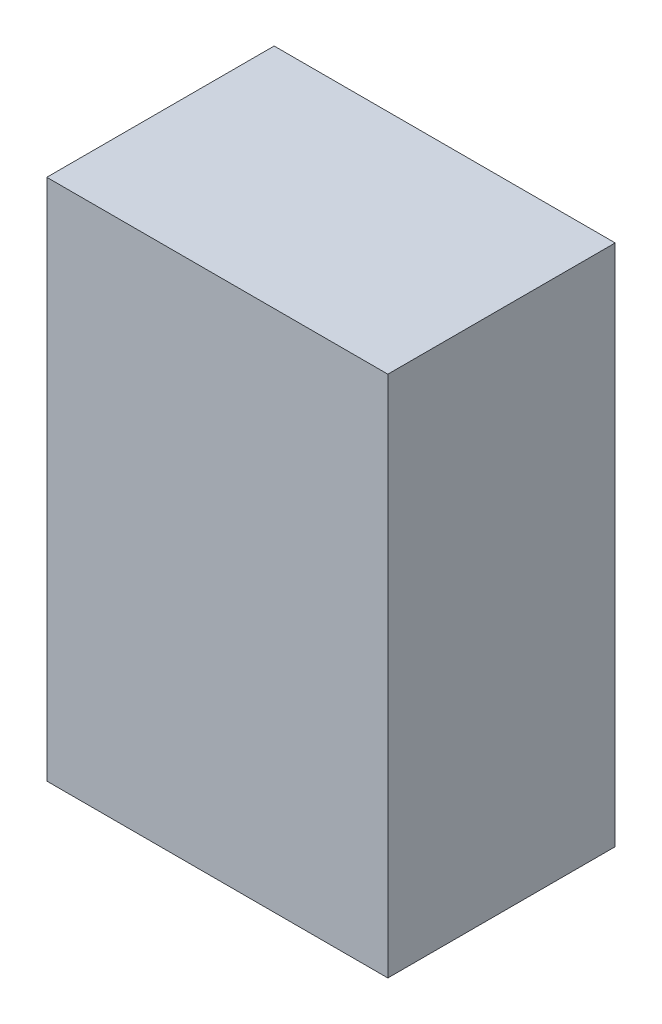
ISO-10303-21;
HEADER;
FILE_DESCRIPTION(('STEP AP214'),'2;1');
FILE_NAME('part.step','',(''),(''),'','','');
FILE_SCHEMA(('AUTOMOTIVE_DESIGN { 1 0 10303 214 1 1 1 1 }'));
ENDSEC;
DATA;
#1=APPLICATION_CONTEXT('core data for automotive mechanical design processes');
#2=APPLICATION_PROTOCOL_DEFINITION('international standard','automotive_design',2000,#1);
#3=PRODUCT_CONTEXT('',#1,'mechanical');
#4=PRODUCT('Part','Part','',(#3));
#5=PRODUCT_RELATED_PRODUCT_CATEGORY('part','',(#4));
#6=PRODUCT_DEFINITION_FORMATION('','',#4);
#7=PRODUCT_DEFINITION_CONTEXT('part definition',#1,'design');
#8=PRODUCT_DEFINITION('design','',#6,#7);
#9=PRODUCT_DEFINITION_SHAPE('','',#8);
#10=(LENGTH_UNIT() NAMED_UNIT(*) SI_UNIT(.MILLI.,.METRE.));
#11=(NAMED_UNIT(*) PLANE_ANGLE_UNIT() SI_UNIT($,.RADIAN.));
#12=(NAMED_UNIT(*) SI_UNIT($,.STERADIAN.) SOLID_ANGLE_UNIT());
#13=UNCERTAINTY_MEASURE_WITH_UNIT(LENGTH_MEASURE(1.E-05),#10,'distance_accuracy_value','');
#14=(GEOMETRIC_REPRESENTATION_CONTEXT(3) GLOBAL_UNCERTAINTY_ASSIGNED_CONTEXT((#13)) GLOBAL_UNIT_ASSIGNED_CONTEXT((#10,
#11,#12)) REPRESENTATION_CONTEXT('',''));
#15=CARTESIAN_POINT('',(0.,0.,0.));
#16=DIRECTION('',(0.,0.,1.));
#17=DIRECTION('',(1.,0.,0.));
#18=AXIS2_PLACEMENT_3D('',#15,#16,#17);
#19=CARTESIAN_POINT('',(0.,0.,0.));
#20=DIRECTION('',(0.,0.,1.));
#21=DIRECTION('',(1.,0.,0.));
#22=AXIS2_PLACEMENT_3D('',#19,#20,#21);
#23=PLANE('',#22);
#24=DIRECTION('',(0.,1.,0.));
#25=VECTOR('',#24,1.);
#26=CARTESIAN_POINT('',(-0.75,1.15,0.));
#27=LINE('',#26,#25);
#28=CARTESIAN_POINT('',(-0.75,1.15,0.));
#29=VERTEX_POINT('',#28);
#30=CARTESIAN_POINT('',(-0.75,-1.15,0.));
#31=VERTEX_POINT('',#30);
#32=EDGE_CURVE('E79',#29,#31,#27,.F.);
#33=ORIENTED_EDGE('',*,*,#32,.F.);
#34=DIRECTION('',(1.,0.,0.));
#35=VECTOR('',#34,1.);
#36=CARTESIAN_POINT('',(0.75,1.15,0.));
#37=LINE('',#36,#35);
#38=CARTESIAN_POINT('',(0.75,1.15,0.));
#39=VERTEX_POINT('',#38);
#40=EDGE_CURVE('E55',#39,#29,#37,.F.);
#41=ORIENTED_EDGE('',*,*,#40,.F.);
#42=DIRECTION('',(0.,1.,0.));
#43=VECTOR('',#42,1.);
#44=CARTESIAN_POINT('',(0.75,-1.15,0.));
#45=LINE('',#44,#43);
#46=CARTESIAN_POINT('',(0.75,-1.15,0.));
#47=VERTEX_POINT('',#46);
#48=EDGE_CURVE('E57',#47,#39,#45,.T.);
#49=ORIENTED_EDGE('',*,*,#48,.F.);
#50=DIRECTION('',(1.,0.,0.));
#51=VECTOR('',#50,1.);
#52=CARTESIAN_POINT('',(-0.75,-1.15,0.));
#53=LINE('',#52,#51);
#54=EDGE_CURVE('E20',#31,#47,#53,.T.);
#55=ORIENTED_EDGE('',*,*,#54,.F.);
#56=EDGE_LOOP('',(#33,#41,#49,#55));
#57=FACE_BOUND('',#56,.T.);
#58=ADVANCED_FACE('F17',(#57),#23,.F.);
#59=CARTESIAN_POINT('',(-0.75,-1.15,0.));
#60=DIRECTION('',(0.,-1.,0.));
#61=DIRECTION('',(0.,0.,-1.));
#62=AXIS2_PLACEMENT_3D('',#59,#60,#61);
#63=PLANE('',#62);
#64=DIRECTION('',(1.,0.,0.));
#65=VECTOR('',#64,1.);
#66=CARTESIAN_POINT('',(0.,-1.15,1.));
#67=LINE('',#66,#65);
#68=CARTESIAN_POINT('',(-0.75,-1.15,1.));
#69=VERTEX_POINT('',#68);
#70=CARTESIAN_POINT('',(0.75,-1.15,1.));
#71=VERTEX_POINT('',#70);
#72=EDGE_CURVE('E83',#69,#71,#67,.T.);
#73=ORIENTED_EDGE('',*,*,#72,.F.);
#74=DIRECTION('',(0.,0.,1.));
#75=VECTOR('',#74,1.);
#76=CARTESIAN_POINT('',(-0.75,-1.15,0.));
#77=LINE('',#76,#75);
#78=EDGE_CURVE('E68',#31,#69,#77,.T.);
#79=ORIENTED_EDGE('',*,*,#78,.F.);
#80=ORIENTED_EDGE('',*,*,#54,.T.);
#81=DIRECTION('',(0.,0.,-1.));
#82=VECTOR('',#81,1.);
#83=CARTESIAN_POINT('',(0.75,-1.15,0.));
#84=LINE('',#83,#82);
#85=EDGE_CURVE('E63',#71,#47,#84,.T.);
#86=ORIENTED_EDGE('',*,*,#85,.F.);
#87=EDGE_LOOP('',(#73,#79,#80,#86));
#88=FACE_BOUND('',#87,.T.);
#89=ADVANCED_FACE('F65',(#88),#63,.T.);
#90=CARTESIAN_POINT('',(0.75,-1.15,0.));
#91=DIRECTION('',(1.,0.,0.));
#92=DIRECTION('',(0.,0.,-1.));
#93=AXIS2_PLACEMENT_3D('',#90,#91,#92);
#94=PLANE('',#93);
#95=DIRECTION('',(0.,1.,0.));
#96=VECTOR('',#95,1.);
#97=CARTESIAN_POINT('',(0.75,0.,1.));
#98=LINE('',#97,#96);
#99=CARTESIAN_POINT('',(0.75,1.15,1.));
#100=VERTEX_POINT('',#99);
#101=EDGE_CURVE('E72',#71,#100,#98,.T.);
#102=ORIENTED_EDGE('',*,*,#101,.F.);
#103=ORIENTED_EDGE('',*,*,#85,.T.);
#104=ORIENTED_EDGE('',*,*,#48,.T.);
#105=DIRECTION('',(0.,0.,1.));
#106=VECTOR('',#105,1.);
#107=CARTESIAN_POINT('',(0.75,1.15,0.));
#108=LINE('',#107,#106);
#109=EDGE_CURVE('E75',#100,#39,#108,.F.);
#110=ORIENTED_EDGE('',*,*,#109,.F.);
#111=EDGE_LOOP('',(#102,#103,#104,#110));
#112=FACE_BOUND('',#111,.T.);
#113=ADVANCED_FACE('F70',(#112),#94,.T.);
#114=CARTESIAN_POINT('',(0.75,1.15,0.));
#115=DIRECTION('',(0.,1.,0.));
#116=DIRECTION('',(0.,0.,1.));
#117=AXIS2_PLACEMENT_3D('',#114,#115,#116);
#118=PLANE('',#117);
#119=DIRECTION('',(1.,0.,0.));
#120=VECTOR('',#119,1.);
#121=CARTESIAN_POINT('',(0.,1.15,1.));
#122=LINE('',#121,#120);
#123=CARTESIAN_POINT('',(-0.75,1.15,1.));
#124=VERTEX_POINT('',#123);
#125=EDGE_CURVE('E26',#100,#124,#122,.F.);
#126=ORIENTED_EDGE('',*,*,#125,.F.);
#127=ORIENTED_EDGE('',*,*,#109,.T.);
#128=ORIENTED_EDGE('',*,*,#40,.T.);
#129=DIRECTION('',(0.,0.,1.));
#130=VECTOR('',#129,1.);
#131=CARTESIAN_POINT('',(-0.75,1.15,0.));
#132=LINE('',#131,#130);
#133=EDGE_CURVE('E35',#124,#29,#132,.F.);
#134=ORIENTED_EDGE('',*,*,#133,.F.);
#135=EDGE_LOOP('',(#126,#127,#128,#134));
#136=FACE_BOUND('',#135,.T.);
#137=ADVANCED_FACE('F89',(#136),#118,.T.);
#138=CARTESIAN_POINT('',(-0.75,1.15,0.));
#139=DIRECTION('',(-1.,0.,0.));
#140=DIRECTION('',(0.,0.,1.));
#141=AXIS2_PLACEMENT_3D('',#138,#139,#140);
#142=PLANE('',#141);
#143=DIRECTION('',(0.,1.,0.));
#144=VECTOR('',#143,1.);
#145=CARTESIAN_POINT('',(-0.75,0.,1.));
#146=LINE('',#145,#144);
#147=EDGE_CURVE('E11',#124,#69,#146,.F.);
#148=ORIENTED_EDGE('',*,*,#147,.F.);
#149=ORIENTED_EDGE('',*,*,#133,.T.);
#150=ORIENTED_EDGE('',*,*,#32,.T.);
#151=ORIENTED_EDGE('',*,*,#78,.T.);
#152=EDGE_LOOP('',(#148,#149,#150,#151));
#153=FACE_BOUND('',#152,.T.);
#154=ADVANCED_FACE('F91',(#153),#142,.T.);
#155=CARTESIAN_POINT('',(0.,0.,1.));
#156=DIRECTION('',(0.,0.,1.));
#157=DIRECTION('',(1.,0.,0.));
#158=AXIS2_PLACEMENT_3D('',#155,#156,#157);
#159=PLANE('',#158);
#160=ORIENTED_EDGE('',*,*,#125,.T.);
#161=ORIENTED_EDGE('',*,*,#147,.T.);
#162=ORIENTED_EDGE('',*,*,#72,.T.);
#163=ORIENTED_EDGE('',*,*,#101,.T.);
#164=EDGE_LOOP('',(#160,#161,#162,#163));
#165=FACE_BOUND('',#164,.T.);
#166=ADVANCED_FACE('F88',(#165),#159,.T.);
#167=CLOSED_SHELL('',(#58,#89,#113,#137,#154,#166));
#168=MANIFOLD_SOLID_BREP('B1',#167);
#169=ADVANCED_BREP_SHAPE_REPRESENTATION('',(#18,#168),#14);
#170=SHAPE_DEFINITION_REPRESENTATION(#9,#169);
ENDSEC;
END-ISO-10303-21;
